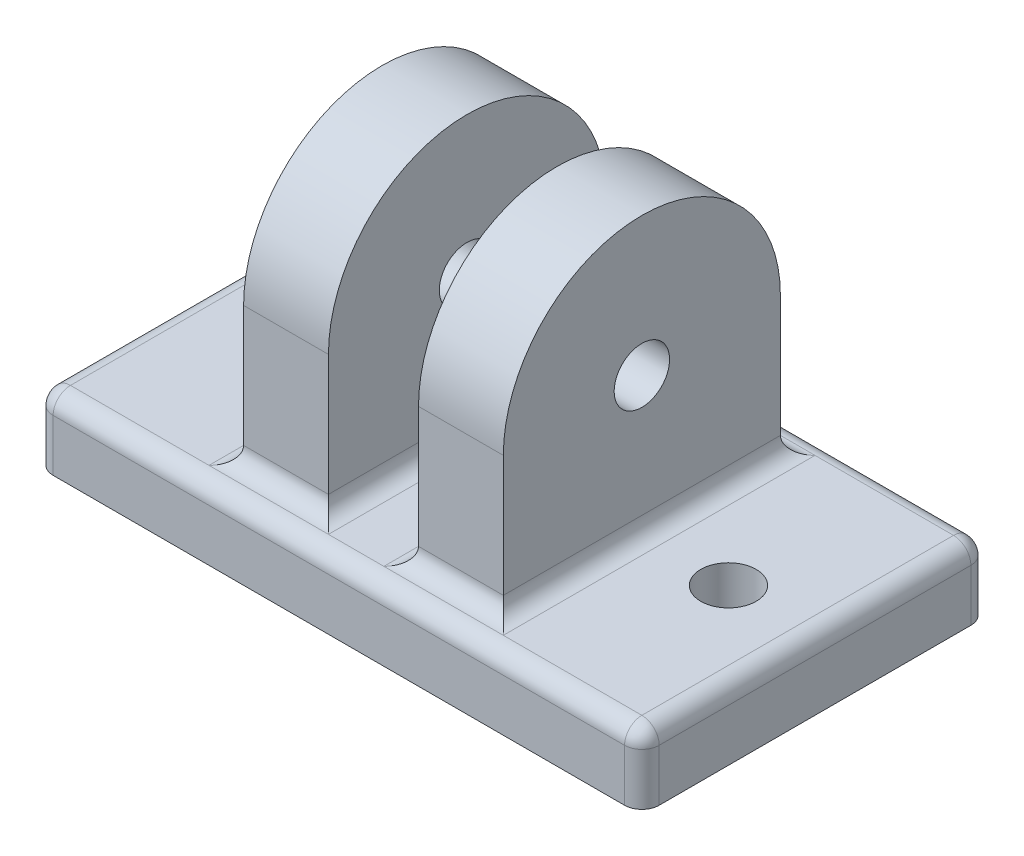
ISO-10303-21;
HEADER;
FILE_DESCRIPTION(('STEP AP214'),'2;1');
FILE_NAME('part.step','',(''),(''),'','','');
FILE_SCHEMA(('AUTOMOTIVE_DESIGN { 1 0 10303 214 1 1 1 1 }'));
ENDSEC;
DATA;
#1=APPLICATION_CONTEXT('core data for automotive mechanical design processes');
#2=APPLICATION_PROTOCOL_DEFINITION('international standard','automotive_design',2000,#1);
#3=PRODUCT_CONTEXT('',#1,'mechanical');
#4=PRODUCT('Part','Part','',(#3));
#5=PRODUCT_RELATED_PRODUCT_CATEGORY('part','',(#4));
#6=PRODUCT_DEFINITION_FORMATION('','',#4);
#7=PRODUCT_DEFINITION_CONTEXT('part definition',#1,'design');
#8=PRODUCT_DEFINITION('design','',#6,#7);
#9=PRODUCT_DEFINITION_SHAPE('','',#8);
#10=(LENGTH_UNIT() NAMED_UNIT(*) SI_UNIT(.MILLI.,.METRE.));
#11=(NAMED_UNIT(*) PLANE_ANGLE_UNIT() SI_UNIT($,.RADIAN.));
#12=(NAMED_UNIT(*) SI_UNIT($,.STERADIAN.) SOLID_ANGLE_UNIT());
#13=UNCERTAINTY_MEASURE_WITH_UNIT(LENGTH_MEASURE(1.E-05),#10,'distance_accuracy_value','');
#14=(GEOMETRIC_REPRESENTATION_CONTEXT(3) GLOBAL_UNCERTAINTY_ASSIGNED_CONTEXT((#13)) GLOBAL_UNIT_ASSIGNED_CONTEXT((#10,
#11,#12)) REPRESENTATION_CONTEXT('',''));
#15=CARTESIAN_POINT('',(0.,0.,0.));
#16=DIRECTION('',(0.,0.,1.));
#17=DIRECTION('',(1.,0.,0.));
#18=AXIS2_PLACEMENT_3D('',#15,#16,#17);
#19=CARTESIAN_POINT('',(15.,-6.,0.));
#20=DIRECTION('',(0.,1.,0.));
#21=DIRECTION('',(0.,0.,1.));
#22=AXIS2_PLACEMENT_3D('',#19,#20,#21);
#23=PLANE('',#22);
#24=DIRECTION('',(0.,0.,1.));
#25=VECTOR('',#24,1.);
#26=CARTESIAN_POINT('',(5.9,-6.,0.));
#27=LINE('',#26,#25);
#28=CARTESIAN_POINT('',(5.9,-6.,-9.));
#29=VERTEX_POINT('',#28);
#30=CARTESIAN_POINT('',(5.9,-6.,8.99999999999999));
#31=VERTEX_POINT('',#30);
#32=EDGE_CURVE('E363',#29,#31,#27,.T.);
#33=ORIENTED_EDGE('',*,*,#32,.T.);
#34=DIRECTION('',(-1.,0.,0.));
#35=VECTOR('',#34,1.);
#36=CARTESIAN_POINT('',(25.,-6.,9.00000000000001));
#37=LINE('',#36,#35);
#38=CARTESIAN_POINT('',(9.1,-6.,8.99999999999999));
#39=VERTEX_POINT('',#38);
#40=EDGE_CURVE('E370',#31,#39,#37,.F.);
#41=ORIENTED_EDGE('',*,*,#40,.T.);
#42=DIRECTION('',(0.,0.,1.));
#43=VECTOR('',#42,1.);
#44=CARTESIAN_POINT('',(9.1,-6.,-8.));
#45=LINE('',#44,#43);
#46=CARTESIAN_POINT('',(9.1,-6.,-9.));
#47=VERTEX_POINT('',#46);
#48=EDGE_CURVE('E366',#39,#47,#45,.F.);
#49=ORIENTED_EDGE('',*,*,#48,.T.);
#50=DIRECTION('',(-1.,0.,0.));
#51=VECTOR('',#50,1.);
#52=CARTESIAN_POINT('',(-10.,-6.,-9.));
#53=LINE('',#52,#51);
#54=EDGE_CURVE('E360',#47,#29,#53,.T.);
#55=ORIENTED_EDGE('',*,*,#54,.T.);
#56=EDGE_LOOP('',(#33,#41,#49,#55));
#57=FACE_BOUND('',#56,.T.);
#58=ADVANCED_FACE('F105',(#57),#23,.T.);
#59=DIRECTION('',(-1.,0.,0.));
#60=VECTOR('',#59,1.);
#61=CARTESIAN_POINT('',(25.,-6.,9.00000000000001));
#62=LINE('',#61,#60);
#63=CARTESIAN_POINT('',(-9.,-6.,9.00000000000001));
#64=VERTEX_POINT('',#63);
#65=CARTESIAN_POINT('',(-1.,-6.,9.00000000000001));
#66=VERTEX_POINT('',#65);
#67=EDGE_CURVE('E353',#64,#66,#62,.F.);
#68=ORIENTED_EDGE('',*,*,#67,.T.);
#69=DIRECTION('',(0.,0.,-1.));
#70=VECTOR('',#69,1.);
#71=CARTESIAN_POINT('',(-1.,-6.,0.));
#72=LINE('',#71,#70);
#73=CARTESIAN_POINT('',(-1.,-6.,-9.));
#74=VERTEX_POINT('',#73);
#75=EDGE_CURVE('E356',#66,#74,#72,.T.);
#76=ORIENTED_EDGE('',*,*,#75,.T.);
#77=DIRECTION('',(-1.,0.,0.));
#78=VECTOR('',#77,1.);
#79=CARTESIAN_POINT('',(-10.,-6.,-9.));
#80=LINE('',#79,#78);
#81=CARTESIAN_POINT('',(-9.,-6.,-9.));
#82=VERTEX_POINT('',#81);
#83=EDGE_CURVE('E347',#74,#82,#80,.T.);
#84=ORIENTED_EDGE('',*,*,#83,.T.);
#85=DIRECTION('',(0.,0.,-1.));
#86=VECTOR('',#85,1.);
#87=CARTESIAN_POINT('',(-9.,-6.,9.99999999999999));
#88=LINE('',#87,#86);
#89=EDGE_CURVE('E350',#82,#64,#88,.F.);
#90=ORIENTED_EDGE('',*,*,#89,.T.);
#91=EDGE_LOOP('',(#68,#76,#84,#90));
#92=FACE_BOUND('',#91,.T.);
#93=CARTESIAN_POINT('',(-5.,-6.,0.));
#94=DIRECTION('',(0.,1.,0.));
#95=DIRECTION('',(0.,0.,1.));
#96=AXIS2_PLACEMENT_3D('',#93,#94,#95);
#97=CIRCLE('',#96,1.6);
#98=CARTESIAN_POINT('',(-5.,-6.,1.6));
#99=VERTEX_POINT('',#98);
#100=EDGE_CURVE('E314',#99,#99,#97,.T.);
#101=ORIENTED_EDGE('',*,*,#100,.F.);
#102=EDGE_LOOP('',(#101));
#103=FACE_BOUND('',#102,.T.);
#104=ADVANCED_FACE('F627',(#92,#103),#23,.T.);
#105=CARTESIAN_POINT('',(15.,0.,0.));
#106=DIRECTION('',(1.,0.,0.));
#107=DIRECTION('',(0.,0.,-1.));
#108=AXIS2_PLACEMENT_3D('',#105,#106,#107);
#109=PLANE('',#108);
#110=CARTESIAN_POINT('',(15.,2.,0.));
#111=DIRECTION('',(-1.,0.,0.));
#112=DIRECTION('',(0.,0.,1.));
#113=AXIS2_PLACEMENT_3D('',#110,#111,#112);
#114=CIRCLE('',#113,1.6);
#115=CARTESIAN_POINT('',(15.,2.,1.6));
#116=VERTEX_POINT('',#115);
#117=EDGE_CURVE('E313',#116,#116,#114,.T.);
#118=ORIENTED_EDGE('',*,*,#117,.T.);
#119=EDGE_LOOP('',(#118));
#120=FACE_BOUND('',#119,.T.);
#121=DIRECTION('',(0.,-1.,0.));
#122=VECTOR('',#121,1.);
#123=CARTESIAN_POINT('',(15.,0.,8.));
#124=LINE('',#123,#122);
#125=CARTESIAN_POINT('',(15.,2.,8.));
#126=VERTEX_POINT('',#125);
#127=CARTESIAN_POINT('',(15.,-5.,7.99999999999999));
#128=VERTEX_POINT('',#127);
#129=EDGE_CURVE('E562',#126,#128,#124,.T.);
#130=ORIENTED_EDGE('',*,*,#129,.T.);
#131=DIRECTION('',(0.,0.,-1.));
#132=VECTOR('',#131,1.);
#133=CARTESIAN_POINT('',(15.,-5.,-8.));
#134=LINE('',#133,#132);
#135=CARTESIAN_POINT('',(15.,-5.,-8.));
#136=VERTEX_POINT('',#135);
#137=EDGE_CURVE('E373',#128,#136,#134,.T.);
#138=ORIENTED_EDGE('',*,*,#137,.T.);
#139=DIRECTION('',(0.,-1.,0.));
#140=VECTOR('',#139,1.);
#141=CARTESIAN_POINT('',(15.,0.,-8.));
#142=LINE('',#141,#140);
#143=CARTESIAN_POINT('',(15.,2.,-8.));
#144=VERTEX_POINT('',#143);
#145=EDGE_CURVE('E291',#144,#136,#142,.T.);
#146=ORIENTED_EDGE('',*,*,#145,.F.);
#147=CARTESIAN_POINT('',(15.,2.,0.));
#148=DIRECTION('',(-1.,0.,0.));
#149=DIRECTION('',(0.,0.,1.));
#150=AXIS2_PLACEMENT_3D('',#147,#148,#149);
#151=CIRCLE('',#150,8.);
#152=EDGE_CURVE('E285',#144,#126,#151,.F.);
#153=ORIENTED_EDGE('',*,*,#152,.T.);
#154=EDGE_LOOP('',(#130,#138,#146,#153));
#155=FACE_BOUND('',#154,.T.);
#156=ADVANCED_FACE('F661',(#120,#155),#109,.T.);
#157=CARTESIAN_POINT('',(0.,0.,0.));
#158=DIRECTION('',(1.,0.,0.));
#159=DIRECTION('',(0.,0.,-1.));
#160=AXIS2_PLACEMENT_3D('',#157,#158,#159);
#161=PLANE('',#160);
#162=CARTESIAN_POINT('',(0.,2.,0.));
#163=DIRECTION('',(-1.,0.,0.));
#164=DIRECTION('',(0.,0.,1.));
#165=AXIS2_PLACEMENT_3D('',#162,#163,#164);
#166=CIRCLE('',#165,1.6);
#167=CARTESIAN_POINT('',(0.,2.,1.6));
#168=VERTEX_POINT('',#167);
#169=EDGE_CURVE('E539',#168,#168,#166,.T.);
#170=ORIENTED_EDGE('',*,*,#169,.F.);
#171=EDGE_LOOP('',(#170));
#172=FACE_BOUND('',#171,.T.);
#173=DIRECTION('',(0.,-1.,0.));
#174=VECTOR('',#173,1.);
#175=CARTESIAN_POINT('',(0.,0.,-8.));
#176=LINE('',#175,#174);
#177=CARTESIAN_POINT('',(0.,2.,-8.));
#178=VERTEX_POINT('',#177);
#179=CARTESIAN_POINT('',(0.,-5.,-8.));
#180=VERTEX_POINT('',#179);
#181=EDGE_CURVE('E281',#178,#180,#176,.T.);
#182=ORIENTED_EDGE('',*,*,#181,.T.);
#183=DIRECTION('',(0.,0.,-1.));
#184=VECTOR('',#183,1.);
#185=CARTESIAN_POINT('',(0.,-5.,0.));
#186=LINE('',#185,#184);
#187=CARTESIAN_POINT('',(0.,-5.,7.99999999999999));
#188=VERTEX_POINT('',#187);
#189=EDGE_CURVE('E384',#180,#188,#186,.F.);
#190=ORIENTED_EDGE('',*,*,#189,.T.);
#191=DIRECTION('',(0.,-1.,0.));
#192=VECTOR('',#191,1.);
#193=CARTESIAN_POINT('',(0.,0.,8.));
#194=LINE('',#193,#192);
#195=CARTESIAN_POINT('',(0.,2.,8.));
#196=VERTEX_POINT('',#195);
#197=EDGE_CURVE('E558',#196,#188,#194,.T.);
#198=ORIENTED_EDGE('',*,*,#197,.F.);
#199=CARTESIAN_POINT('',(0.,2.,0.));
#200=DIRECTION('',(-1.,0.,0.));
#201=DIRECTION('',(0.,0.,1.));
#202=AXIS2_PLACEMENT_3D('',#199,#200,#201);
#203=CIRCLE('',#202,8.);
#204=EDGE_CURVE('E572',#178,#196,#203,.F.);
#205=ORIENTED_EDGE('',*,*,#204,.F.);
#206=EDGE_LOOP('',(#182,#190,#198,#205));
#207=FACE_BOUND('',#206,.T.);
#208=ADVANCED_FACE('F704',(#172,#207),#161,.F.);
#209=CARTESIAN_POINT('',(15.,0.,-8.));
#210=DIRECTION('',(0.,0.,-1.));
#211=DIRECTION('',(0.,1.,0.));
#212=AXIS2_PLACEMENT_3D('',#209,#210,#211);
#213=PLANE('',#212);
#214=ORIENTED_EDGE('',*,*,#145,.T.);
#215=DIRECTION('',(-1.,0.,0.));
#216=VECTOR('',#215,1.);
#217=CARTESIAN_POINT('',(10.1,-5.,-8.));
#218=LINE('',#217,#216);
#219=CARTESIAN_POINT('',(10.1,-5.,-8.));
#220=VERTEX_POINT('',#219);
#221=EDGE_CURVE('E376',#136,#220,#218,.T.);
#222=ORIENTED_EDGE('',*,*,#221,.T.);
#223=DIRECTION('',(0.,1.,0.));
#224=VECTOR('',#223,1.);
#225=CARTESIAN_POINT('',(10.1,0.,-8.));
#226=LINE('',#225,#224);
#227=CARTESIAN_POINT('',(10.1,2.,-8.));
#228=VERTEX_POINT('',#227);
#229=EDGE_CURVE('E555',#220,#228,#226,.T.);
#230=ORIENTED_EDGE('',*,*,#229,.T.);
#231=DIRECTION('',(-1.,0.,0.));
#232=VECTOR('',#231,1.);
#233=CARTESIAN_POINT('',(15.,2.,-8.));
#234=LINE('',#233,#232);
#235=EDGE_CURVE('E284',#144,#228,#234,.T.);
#236=ORIENTED_EDGE('',*,*,#235,.F.);
#237=EDGE_LOOP('',(#214,#222,#230,#236));
#238=FACE_BOUND('',#237,.T.);
#239=ADVANCED_FACE('F579',(#238),#213,.T.);
#240=CARTESIAN_POINT('',(15.,2.,0.));
#241=DIRECTION('',(-1.,0.,0.));
#242=DIRECTION('',(0.,0.,1.));
#243=AXIS2_PLACEMENT_3D('',#240,#241,#242);
#244=CYLINDRICAL_SURFACE('',#243,8.);
#245=CARTESIAN_POINT('',(10.1,2.,0.));
#246=DIRECTION('',(-1.,0.,0.));
#247=DIRECTION('',(0.,0.,1.));
#248=AXIS2_PLACEMENT_3D('',#245,#246,#247);
#249=CIRCLE('',#248,8.);
#250=CARTESIAN_POINT('',(10.1,2.,8.));
#251=VERTEX_POINT('',#250);
#252=EDGE_CURVE('E268',#251,#228,#249,.T.);
#253=ORIENTED_EDGE('',*,*,#252,.F.);
#254=DIRECTION('',(-1.,0.,0.));
#255=VECTOR('',#254,1.);
#256=CARTESIAN_POINT('',(15.,2.,8.));
#257=LINE('',#256,#255);
#258=EDGE_CURVE('E566',#126,#251,#257,.T.);
#259=ORIENTED_EDGE('',*,*,#258,.F.);
#260=ORIENTED_EDGE('',*,*,#152,.F.);
#261=ORIENTED_EDGE('',*,*,#235,.T.);
#262=EDGE_LOOP('',(#253,#259,#260,#261));
#263=FACE_BOUND('',#262,.T.);
#264=ADVANCED_FACE('F665',(#263),#244,.T.);
#265=CARTESIAN_POINT('',(15.,0.,8.));
#266=DIRECTION('',(0.,0.,-1.));
#267=DIRECTION('',(0.,1.,0.));
#268=AXIS2_PLACEMENT_3D('',#265,#266,#267);
#269=PLANE('',#268);
#270=DIRECTION('',(0.,1.,0.));
#271=VECTOR('',#270,1.);
#272=CARTESIAN_POINT('',(10.1,0.,8.));
#273=LINE('',#272,#271);
#274=CARTESIAN_POINT('',(10.1,-5.,7.99999999999999));
#275=VERTEX_POINT('',#274);
#276=EDGE_CURVE('E305',#275,#251,#273,.T.);
#277=ORIENTED_EDGE('',*,*,#276,.F.);
#278=DIRECTION('',(-1.,0.,0.));
#279=VECTOR('',#278,1.);
#280=CARTESIAN_POINT('',(15.,-5.,7.99999999999999));
#281=LINE('',#280,#279);
#282=EDGE_CURVE('E327',#275,#128,#281,.F.);
#283=ORIENTED_EDGE('',*,*,#282,.T.);
#284=ORIENTED_EDGE('',*,*,#129,.F.);
#285=ORIENTED_EDGE('',*,*,#258,.T.);
#286=EDGE_LOOP('',(#277,#283,#284,#285));
#287=FACE_BOUND('',#286,.T.);
#288=ADVANCED_FACE('F660',(#287),#269,.F.);
#289=CARTESIAN_POINT('',(15.,-10.,-10.));
#290=DIRECTION('',(0.,0.,1.));
#291=DIRECTION('',(1.,0.,0.));
#292=AXIS2_PLACEMENT_3D('',#289,#290,#291);
#293=PLANE('',#292);
#294=DIRECTION('',(-1.,0.,0.));
#295=VECTOR('',#294,1.);
#296=CARTESIAN_POINT('',(15.,-10.,-10.));
#297=LINE('',#296,#295);
#298=CARTESIAN_POINT('',(24.,-10.,-10.));
#299=VERTEX_POINT('',#298);
#300=CARTESIAN_POINT('',(-9.,-10.,-10.));
#301=VERTEX_POINT('',#300);
#302=EDGE_CURVE('E290',#299,#301,#297,.T.);
#303=ORIENTED_EDGE('',*,*,#302,.T.);
#304=DIRECTION('',(0.,-1.,0.));
#305=VECTOR('',#304,1.);
#306=CARTESIAN_POINT('',(-9.,-10.,-10.));
#307=LINE('',#306,#305);
#308=CARTESIAN_POINT('',(-9.,-7.,-10.));
#309=VERTEX_POINT('',#308);
#310=EDGE_CURVE('E412',#301,#309,#307,.F.);
#311=ORIENTED_EDGE('',*,*,#310,.T.);
#312=DIRECTION('',(-1.,0.,0.));
#313=VECTOR('',#312,1.);
#314=CARTESIAN_POINT('',(25.,-7.,-10.));
#315=LINE('',#314,#313);
#316=CARTESIAN_POINT('',(24.,-7.,-10.));
#317=VERTEX_POINT('',#316);
#318=EDGE_CURVE('E409',#309,#317,#315,.F.);
#319=ORIENTED_EDGE('',*,*,#318,.T.);
#320=DIRECTION('',(0.,-1.,0.));
#321=VECTOR('',#320,1.);
#322=CARTESIAN_POINT('',(24.,-10.,-10.));
#323=LINE('',#322,#321);
#324=EDGE_CURVE('E406',#317,#299,#323,.T.);
#325=ORIENTED_EDGE('',*,*,#324,.T.);
#326=EDGE_LOOP('',(#303,#311,#319,#325));
#327=FACE_BOUND('',#326,.T.);
#328=ADVANCED_FACE('F719',(#327),#293,.F.);
#329=CARTESIAN_POINT('',(15.,-10.,10.));
#330=DIRECTION('',(0.,0.,-1.));
#331=DIRECTION('',(-1.,0.,0.));
#332=AXIS2_PLACEMENT_3D('',#329,#330,#331);
#333=PLANE('',#332);
#334=DIRECTION('',(-1.,0.,0.));
#335=VECTOR('',#334,1.);
#336=CARTESIAN_POINT('',(-10.,-7.,10.));
#337=LINE('',#336,#335);
#338=CARTESIAN_POINT('',(24.,-7.,10.));
#339=VERTEX_POINT('',#338);
#340=CARTESIAN_POINT('',(-9.,-7.,10.));
#341=VERTEX_POINT('',#340);
#342=EDGE_CURVE('E390',#339,#341,#337,.T.);
#343=ORIENTED_EDGE('',*,*,#342,.T.);
#344=DIRECTION('',(0.,1.,0.));
#345=VECTOR('',#344,1.);
#346=CARTESIAN_POINT('',(-9.,-10.,10.));
#347=LINE('',#346,#345);
#348=CARTESIAN_POINT('',(-9.,-10.,10.));
#349=VERTEX_POINT('',#348);
#350=EDGE_CURVE('E394',#341,#349,#347,.F.);
#351=ORIENTED_EDGE('',*,*,#350,.T.);
#352=DIRECTION('',(-1.,0.,0.));
#353=VECTOR('',#352,1.);
#354=CARTESIAN_POINT('',(15.,-10.,10.));
#355=LINE('',#354,#353);
#356=CARTESIAN_POINT('',(24.,-10.,10.));
#357=VERTEX_POINT('',#356);
#358=EDGE_CURVE('E298',#357,#349,#355,.T.);
#359=ORIENTED_EDGE('',*,*,#358,.F.);
#360=DIRECTION('',(0.,1.,0.));
#361=VECTOR('',#360,1.);
#362=CARTESIAN_POINT('',(24.,-6.00000000000001,10.));
#363=LINE('',#362,#361);
#364=EDGE_CURVE('E387',#357,#339,#363,.T.);
#365=ORIENTED_EDGE('',*,*,#364,.T.);
#366=EDGE_LOOP('',(#343,#351,#359,#365));
#367=FACE_BOUND('',#366,.T.);
#368=ADVANCED_FACE('F644',(#367),#333,.F.);
#369=CARTESIAN_POINT('',(15.,-10.,10.));
#370=DIRECTION('',(0.,1.,0.));
#371=DIRECTION('',(0.,0.,1.));
#372=AXIS2_PLACEMENT_3D('',#369,#370,#371);
#373=PLANE('',#372);
#374=CARTESIAN_POINT('',(20.,-10.,0.));
#375=DIRECTION('',(0.,1.,0.));
#376=DIRECTION('',(0.,0.,1.));
#377=AXIS2_PLACEMENT_3D('',#374,#375,#376);
#378=CIRCLE('',#377,1.6);
#379=CARTESIAN_POINT('',(20.,-10.,1.6));
#380=VERTEX_POINT('',#379);
#381=EDGE_CURVE('E319',#380,#380,#378,.T.);
#382=ORIENTED_EDGE('',*,*,#381,.T.);
#383=EDGE_LOOP('',(#382));
#384=FACE_BOUND('',#383,.T.);
#385=CARTESIAN_POINT('',(-5.,-10.,0.));
#386=DIRECTION('',(0.,1.,0.));
#387=DIRECTION('',(0.,0.,-1.));
#388=AXIS2_PLACEMENT_3D('',#385,#386,#387);
#389=CIRCLE('',#388,1.6);
#390=CARTESIAN_POINT('',(-5.,-10.,-1.6));
#391=VERTEX_POINT('',#390);
#392=EDGE_CURVE('E521',#391,#391,#389,.T.);
#393=ORIENTED_EDGE('',*,*,#392,.T.);
#394=EDGE_LOOP('',(#393));
#395=FACE_BOUND('',#394,.T.);
#396=DIRECTION('',(0.,0.,1.));
#397=VECTOR('',#396,1.);
#398=CARTESIAN_POINT('',(-10.,-10.,-10.));
#399=LINE('',#398,#397);
#400=CARTESIAN_POINT('',(-10.,-10.,-9.));
#401=VERTEX_POINT('',#400);
#402=CARTESIAN_POINT('',(-10.,-10.,9.00000000000001));
#403=VERTEX_POINT('',#402);
#404=EDGE_CURVE('E535',#401,#403,#399,.T.);
#405=ORIENTED_EDGE('',*,*,#404,.F.);
#406=CARTESIAN_POINT('',(-9.,-10.,-9.));
#407=DIRECTION('',(0.,1.,0.));
#408=DIRECTION('',(0.,0.,1.));
#409=AXIS2_PLACEMENT_3D('',#406,#407,#408);
#410=CIRCLE('',#409,1.);
#411=EDGE_CURVE('E12',#401,#301,#410,.F.);
#412=ORIENTED_EDGE('',*,*,#411,.T.);
#413=ORIENTED_EDGE('',*,*,#302,.F.);
#414=CARTESIAN_POINT('',(24.,-10.,-9.));
#415=DIRECTION('',(0.,1.,0.));
#416=DIRECTION('',(0.,0.,1.));
#417=AXIS2_PLACEMENT_3D('',#414,#415,#416);
#418=CIRCLE('',#417,1.);
#419=CARTESIAN_POINT('',(25.,-10.,-9.));
#420=VERTEX_POINT('',#419);
#421=EDGE_CURVE('E422',#299,#420,#418,.F.);
#422=ORIENTED_EDGE('',*,*,#421,.T.);
#423=DIRECTION('',(0.,0.,1.));
#424=VECTOR('',#423,1.);
#425=CARTESIAN_POINT('',(25.,-10.,-10.));
#426=LINE('',#425,#424);
#427=CARTESIAN_POINT('',(25.,-10.,9.00000000000001));
#428=VERTEX_POINT('',#427);
#429=EDGE_CURVE('E323',#420,#428,#426,.T.);
#430=ORIENTED_EDGE('',*,*,#429,.T.);
#431=CARTESIAN_POINT('',(24.,-10.,9.00000000000001));
#432=DIRECTION('',(0.,1.,0.));
#433=DIRECTION('',(0.,0.,1.));
#434=AXIS2_PLACEMENT_3D('',#431,#432,#433);
#435=CIRCLE('',#434,1.);
#436=EDGE_CURVE('E425',#428,#357,#435,.F.);
#437=ORIENTED_EDGE('',*,*,#436,.T.);
#438=ORIENTED_EDGE('',*,*,#358,.T.);
#439=CARTESIAN_POINT('',(-9.,-10.,9.00000000000001));
#440=DIRECTION('',(0.,1.,0.));
#441=DIRECTION('',(0.,0.,1.));
#442=AXIS2_PLACEMENT_3D('',#439,#440,#441);
#443=CIRCLE('',#442,1.);
#444=EDGE_CURVE('E115',#349,#403,#443,.F.);
#445=ORIENTED_EDGE('',*,*,#444,.T.);
#446=EDGE_LOOP('',(#405,#412,#413,#422,#430,#437,#438,#445));
#447=FACE_BOUND('',#446,.T.);
#448=ADVANCED_FACE('F695',(#384,#395,#447),#373,.F.);
#449=DIRECTION('',(0.,1.,0.));
#450=VECTOR('',#449,1.);
#451=CARTESIAN_POINT('',(4.9,0.,-8.));
#452=LINE('',#451,#450);
#453=CARTESIAN_POINT('',(4.9,-5.,-8.));
#454=VERTEX_POINT('',#453);
#455=CARTESIAN_POINT('',(4.9,2.,-8.));
#456=VERTEX_POINT('',#455);
#457=EDGE_CURVE('E256',#454,#456,#452,.T.);
#458=ORIENTED_EDGE('',*,*,#457,.F.);
#459=DIRECTION('',(-1.,0.,0.));
#460=VECTOR('',#459,1.);
#461=CARTESIAN_POINT('',(0.,-5.,-8.));
#462=LINE('',#461,#460);
#463=EDGE_CURVE('E381',#454,#180,#462,.T.);
#464=ORIENTED_EDGE('',*,*,#463,.T.);
#465=ORIENTED_EDGE('',*,*,#181,.F.);
#466=EDGE_CURVE('E273',#456,#178,#234,.T.);
#467=ORIENTED_EDGE('',*,*,#466,.F.);
#468=EDGE_LOOP('',(#458,#464,#465,#467));
#469=FACE_BOUND('',#468,.T.);
#470=ADVANCED_FACE('F279',(#469),#213,.T.);
#471=DIRECTION('',(-1.,0.,0.));
#472=VECTOR('',#471,1.);
#473=CARTESIAN_POINT('',(-10.,-6.,-9.));
#474=LINE('',#473,#472);
#475=CARTESIAN_POINT('',(24.,-6.,-9.));
#476=VERTEX_POINT('',#475);
#477=CARTESIAN_POINT('',(16.,-6.,-9.));
#478=VERTEX_POINT('',#477);
#479=EDGE_CURVE('E337',#476,#478,#474,.T.);
#480=ORIENTED_EDGE('',*,*,#479,.T.);
#481=DIRECTION('',(0.,0.,-1.));
#482=VECTOR('',#481,1.);
#483=CARTESIAN_POINT('',(16.,-6.,7.99999999999999));
#484=LINE('',#483,#482);
#485=CARTESIAN_POINT('',(16.,-6.,9.00000000000001));
#486=VERTEX_POINT('',#485);
#487=EDGE_CURVE('E343',#478,#486,#484,.F.);
#488=ORIENTED_EDGE('',*,*,#487,.T.);
#489=DIRECTION('',(-1.,0.,0.));
#490=VECTOR('',#489,1.);
#491=CARTESIAN_POINT('',(25.,-6.,9.00000000000001));
#492=LINE('',#491,#490);
#493=CARTESIAN_POINT('',(24.,-6.,9.00000000000001));
#494=VERTEX_POINT('',#493);
#495=EDGE_CURVE('E340',#486,#494,#492,.F.);
#496=ORIENTED_EDGE('',*,*,#495,.T.);
#497=DIRECTION('',(0.,0.,-1.));
#498=VECTOR('',#497,1.);
#499=CARTESIAN_POINT('',(24.,-6.,0.));
#500=LINE('',#499,#498);
#501=EDGE_CURVE('E334',#494,#476,#500,.T.);
#502=ORIENTED_EDGE('',*,*,#501,.T.);
#503=EDGE_LOOP('',(#480,#488,#496,#502));
#504=FACE_BOUND('',#503,.T.);
#505=CARTESIAN_POINT('',(20.,-6.,0.));
#506=DIRECTION('',(0.,1.,0.));
#507=DIRECTION('',(0.,0.,1.));
#508=AXIS2_PLACEMENT_3D('',#505,#506,#507);
#509=CIRCLE('',#508,1.6);
#510=CARTESIAN_POINT('',(20.,-6.,1.6));
#511=VERTEX_POINT('',#510);
#512=EDGE_CURVE('E318',#511,#511,#509,.T.);
#513=ORIENTED_EDGE('',*,*,#512,.F.);
#514=EDGE_LOOP('',(#513));
#515=FACE_BOUND('',#514,.T.);
#516=ADVANCED_FACE('F595',(#504,#515),#23,.T.);
#517=CARTESIAN_POINT('',(4.9,2.,0.));
#518=DIRECTION('',(-1.,0.,0.));
#519=DIRECTION('',(0.,0.,1.));
#520=AXIS2_PLACEMENT_3D('',#517,#518,#519);
#521=CIRCLE('',#520,8.);
#522=CARTESIAN_POINT('',(4.9,2.,8.));
#523=VERTEX_POINT('',#522);
#524=EDGE_CURVE('E260',#523,#456,#521,.T.);
#525=ORIENTED_EDGE('',*,*,#524,.T.);
#526=ORIENTED_EDGE('',*,*,#466,.T.);
#527=ORIENTED_EDGE('',*,*,#204,.T.);
#528=EDGE_CURVE('E275',#523,#196,#257,.T.);
#529=ORIENTED_EDGE('',*,*,#528,.F.);
#530=EDGE_LOOP('',(#525,#526,#527,#529));
#531=FACE_BOUND('',#530,.T.);
#532=ADVANCED_FACE('F271',(#531),#244,.T.);
#533=ORIENTED_EDGE('',*,*,#197,.T.);
#534=DIRECTION('',(-1.,0.,0.));
#535=VECTOR('',#534,1.);
#536=CARTESIAN_POINT('',(15.,-5.,7.99999999999999));
#537=LINE('',#536,#535);
#538=CARTESIAN_POINT('',(4.9,-5.,7.99999999999999));
#539=VERTEX_POINT('',#538);
#540=EDGE_CURVE('E308',#188,#539,#537,.F.);
#541=ORIENTED_EDGE('',*,*,#540,.T.);
#542=DIRECTION('',(0.,1.,0.));
#543=VECTOR('',#542,1.);
#544=CARTESIAN_POINT('',(4.9,0.,8.));
#545=LINE('',#544,#543);
#546=EDGE_CURVE('E302',#539,#523,#545,.T.);
#547=ORIENTED_EDGE('',*,*,#546,.T.);
#548=ORIENTED_EDGE('',*,*,#528,.T.);
#549=EDGE_LOOP('',(#533,#541,#547,#548));
#550=FACE_BOUND('',#549,.T.);
#551=ADVANCED_FACE('F669',(#550),#269,.F.);
#552=CARTESIAN_POINT('',(10.1,0.,0.));
#553=DIRECTION('',(-1.,0.,0.));
#554=DIRECTION('',(0.,0.,1.));
#555=AXIS2_PLACEMENT_3D('',#552,#553,#554);
#556=PLANE('',#555);
#557=CARTESIAN_POINT('',(10.1,2.,0.));
#558=DIRECTION('',(-1.,0.,0.));
#559=DIRECTION('',(0.,0.,1.));
#560=AXIS2_PLACEMENT_3D('',#557,#558,#559);
#561=CIRCLE('',#560,1.6);
#562=CARTESIAN_POINT('',(10.1,2.,1.6));
#563=VERTEX_POINT('',#562);
#564=EDGE_CURVE('E277',#563,#563,#561,.T.);
#565=ORIENTED_EDGE('',*,*,#564,.F.);
#566=EDGE_LOOP('',(#565));
#567=FACE_BOUND('',#566,.T.);
#568=ORIENTED_EDGE('',*,*,#229,.F.);
#569=DIRECTION('',(0.,0.,1.));
#570=VECTOR('',#569,1.);
#571=CARTESIAN_POINT('',(10.1,-5.,8.));
#572=LINE('',#571,#570);
#573=EDGE_CURVE('E331',#220,#275,#572,.T.);
#574=ORIENTED_EDGE('',*,*,#573,.T.);
#575=ORIENTED_EDGE('',*,*,#276,.T.);
#576=ORIENTED_EDGE('',*,*,#252,.T.);
#577=EDGE_LOOP('',(#568,#574,#575,#576));
#578=FACE_BOUND('',#577,.T.);
#579=ADVANCED_FACE('F667',(#567,#578),#556,.T.);
#580=CARTESIAN_POINT('',(4.9,0.,0.));
#581=DIRECTION('',(-1.,0.,0.));
#582=DIRECTION('',(0.,0.,1.));
#583=AXIS2_PLACEMENT_3D('',#580,#581,#582);
#584=PLANE('',#583);
#585=CARTESIAN_POINT('',(4.9,2.,0.));
#586=DIRECTION('',(-1.,0.,0.));
#587=DIRECTION('',(0.,0.,1.));
#588=AXIS2_PLACEMENT_3D('',#585,#586,#587);
#589=CIRCLE('',#588,1.6);
#590=CARTESIAN_POINT('',(4.9,2.,1.6));
#591=VERTEX_POINT('',#590);
#592=EDGE_CURVE('E309',#591,#591,#589,.T.);
#593=ORIENTED_EDGE('',*,*,#592,.T.);
#594=EDGE_LOOP('',(#593));
#595=FACE_BOUND('',#594,.T.);
#596=ORIENTED_EDGE('',*,*,#546,.F.);
#597=DIRECTION('',(0.,0.,1.));
#598=VECTOR('',#597,1.);
#599=CARTESIAN_POINT('',(4.9,-5.,0.));
#600=LINE('',#599,#598);
#601=EDGE_CURVE('E263',#539,#454,#600,.F.);
#602=ORIENTED_EDGE('',*,*,#601,.T.);
#603=ORIENTED_EDGE('',*,*,#457,.T.);
#604=ORIENTED_EDGE('',*,*,#524,.F.);
#605=EDGE_LOOP('',(#596,#602,#603,#604));
#606=FACE_BOUND('',#605,.T.);
#607=ADVANCED_FACE('F259',(#595,#606),#584,.F.);
#608=CARTESIAN_POINT('',(15.,2.,0.));
#609=DIRECTION('',(-1.,0.,0.));
#610=DIRECTION('',(0.,0.,1.));
#611=AXIS2_PLACEMENT_3D('',#608,#609,#610);
#612=CYLINDRICAL_SURFACE('',#611,1.6);
#613=ORIENTED_EDGE('',*,*,#169,.T.);
#614=EDGE_LOOP('',(#613));
#615=FACE_BOUND('',#614,.T.);
#616=ORIENTED_EDGE('',*,*,#592,.F.);
#617=EDGE_LOOP('',(#616));
#618=FACE_BOUND('',#617,.T.);
#619=ADVANCED_FACE('F676',(#615,#618),#612,.F.);
#620=ORIENTED_EDGE('',*,*,#564,.T.);
#621=EDGE_LOOP('',(#620));
#622=FACE_BOUND('',#621,.T.);
#623=ORIENTED_EDGE('',*,*,#117,.F.);
#624=EDGE_LOOP('',(#623));
#625=FACE_BOUND('',#624,.T.);
#626=ADVANCED_FACE('F792',(#622,#625),#612,.F.);
#627=CARTESIAN_POINT('',(-10.,0.,0.));
#628=DIRECTION('',(1.,0.,0.));
#629=DIRECTION('',(0.,0.,-1.));
#630=AXIS2_PLACEMENT_3D('',#627,#628,#629);
#631=PLANE('',#630);
#632=DIRECTION('',(0.,0.,-1.));
#633=VECTOR('',#632,1.);
#634=CARTESIAN_POINT('',(-10.,-7.,-10.));
#635=LINE('',#634,#633);
#636=CARTESIAN_POINT('',(-10.,-7.,9.00000000000001));
#637=VERTEX_POINT('',#636);
#638=CARTESIAN_POINT('',(-10.,-7.,-9.));
#639=VERTEX_POINT('',#638);
#640=EDGE_CURVE('E400',#637,#639,#635,.T.);
#641=ORIENTED_EDGE('',*,*,#640,.T.);
#642=DIRECTION('',(0.,-1.,0.));
#643=VECTOR('',#642,1.);
#644=CARTESIAN_POINT('',(-10.,0.,-9.));
#645=LINE('',#644,#643);
#646=EDGE_CURVE('E403',#639,#401,#645,.T.);
#647=ORIENTED_EDGE('',*,*,#646,.T.);
#648=ORIENTED_EDGE('',*,*,#404,.T.);
#649=DIRECTION('',(0.,1.,0.));
#650=VECTOR('',#649,1.);
#651=CARTESIAN_POINT('',(-10.,0.,9.00000000000001));
#652=LINE('',#651,#650);
#653=EDGE_CURVE('E397',#403,#637,#652,.T.);
#654=ORIENTED_EDGE('',*,*,#653,.T.);
#655=EDGE_LOOP('',(#641,#647,#648,#654));
#656=FACE_BOUND('',#655,.T.);
#657=ADVANCED_FACE('F784',(#656),#631,.F.);
#658=CARTESIAN_POINT('',(25.,0.,0.));
#659=DIRECTION('',(1.,0.,0.));
#660=DIRECTION('',(0.,0.,-1.));
#661=AXIS2_PLACEMENT_3D('',#658,#659,#660);
#662=PLANE('',#661);
#663=DIRECTION('',(0.,0.,-1.));
#664=VECTOR('',#663,1.);
#665=CARTESIAN_POINT('',(25.,-7.,0.));
#666=LINE('',#665,#664);
#667=CARTESIAN_POINT('',(25.,-7.,-9.));
#668=VERTEX_POINT('',#667);
#669=CARTESIAN_POINT('',(25.,-7.,9.00000000000001));
#670=VERTEX_POINT('',#669);
#671=EDGE_CURVE('E123',#668,#670,#666,.F.);
#672=ORIENTED_EDGE('',*,*,#671,.T.);
#673=DIRECTION('',(0.,1.,0.));
#674=VECTOR('',#673,1.);
#675=CARTESIAN_POINT('',(25.,-10.,9.00000000000001));
#676=LINE('',#675,#674);
#677=EDGE_CURVE('E419',#670,#428,#676,.F.);
#678=ORIENTED_EDGE('',*,*,#677,.T.);
#679=ORIENTED_EDGE('',*,*,#429,.F.);
#680=DIRECTION('',(0.,-1.,0.));
#681=VECTOR('',#680,1.);
#682=CARTESIAN_POINT('',(25.,-6.00000000000001,-9.));
#683=LINE('',#682,#681);
#684=EDGE_CURVE('E128',#420,#668,#683,.F.);
#685=ORIENTED_EDGE('',*,*,#684,.T.);
#686=EDGE_LOOP('',(#672,#678,#679,#685));
#687=FACE_BOUND('',#686,.T.);
#688=ADVANCED_FACE('F781',(#687),#662,.T.);
#689=CARTESIAN_POINT('',(-5.,-10.,0.));
#690=DIRECTION('',(0.,1.,0.));
#691=DIRECTION('',(0.,0.,1.));
#692=AXIS2_PLACEMENT_3D('',#689,#690,#691);
#693=CYLINDRICAL_SURFACE('',#692,1.6);
#694=ORIENTED_EDGE('',*,*,#100,.T.);
#695=EDGE_LOOP('',(#694));
#696=FACE_BOUND('',#695,.T.);
#697=ORIENTED_EDGE('',*,*,#392,.F.);
#698=EDGE_LOOP('',(#697));
#699=FACE_BOUND('',#698,.T.);
#700=ADVANCED_FACE('F783',(#696,#699),#693,.F.);
#701=CARTESIAN_POINT('',(20.,-10.,0.));
#702=DIRECTION('',(0.,1.,0.));
#703=DIRECTION('',(0.,0.,1.));
#704=AXIS2_PLACEMENT_3D('',#701,#702,#703);
#705=CYLINDRICAL_SURFACE('',#704,1.6);
#706=ORIENTED_EDGE('',*,*,#512,.T.);
#707=EDGE_LOOP('',(#706));
#708=FACE_BOUND('',#707,.T.);
#709=ORIENTED_EDGE('',*,*,#381,.F.);
#710=EDGE_LOOP('',(#709));
#711=FACE_BOUND('',#710,.T.);
#712=ADVANCED_FACE('F774',(#708,#711),#705,.F.);
#713=CARTESIAN_POINT('',(-9.,0.,-9.));
#714=DIRECTION('',(0.,-1.,0.));
#715=DIRECTION('',(0.,0.,-1.));
#716=AXIS2_PLACEMENT_3D('',#713,#714,#715);
#717=CYLINDRICAL_SURFACE('',#716,1.);
#718=ORIENTED_EDGE('',*,*,#411,.F.);
#719=ORIENTED_EDGE('',*,*,#646,.F.);
#720=CARTESIAN_POINT('',(-9.,-7.,-9.));
#721=DIRECTION('',(0.,1.,0.));
#722=DIRECTION('',(0.,0.,1.));
#723=AXIS2_PLACEMENT_3D('',#720,#721,#722);
#724=CIRCLE('',#723,1.);
#725=EDGE_CURVE('E109',#309,#639,#724,.T.);
#726=ORIENTED_EDGE('',*,*,#725,.F.);
#727=ORIENTED_EDGE('',*,*,#310,.F.);
#728=EDGE_LOOP('',(#718,#719,#726,#727));
#729=FACE_BOUND('',#728,.T.);
#730=ADVANCED_FACE('F107',(#729),#717,.T.);
#731=CARTESIAN_POINT('',(24.,-10.,-9.));
#732=DIRECTION('',(0.,1.,0.));
#733=DIRECTION('',(0.,0.,1.));
#734=AXIS2_PLACEMENT_3D('',#731,#732,#733);
#735=CYLINDRICAL_SURFACE('',#734,1.);
#736=ORIENTED_EDGE('',*,*,#421,.F.);
#737=ORIENTED_EDGE('',*,*,#324,.F.);
#738=CARTESIAN_POINT('',(24.,-7.,-9.));
#739=DIRECTION('',(0.,1.,0.));
#740=DIRECTION('',(0.,0.,1.));
#741=AXIS2_PLACEMENT_3D('',#738,#739,#740);
#742=CIRCLE('',#741,1.);
#743=EDGE_CURVE('E513',#668,#317,#742,.T.);
#744=ORIENTED_EDGE('',*,*,#743,.F.);
#745=ORIENTED_EDGE('',*,*,#684,.F.);
#746=EDGE_LOOP('',(#736,#737,#744,#745));
#747=FACE_BOUND('',#746,.T.);
#748=ADVANCED_FACE('F768',(#747),#735,.T.);
#749=CARTESIAN_POINT('',(-9.,-7.,-9.));
#750=DIRECTION('',(-1.,0.,0.));
#751=DIRECTION('',(0.,0.,1.));
#752=AXIS2_PLACEMENT_3D('',#749,#750,#751);
#753=SPHERICAL_SURFACE('',#752,1.);
#754=CARTESIAN_POINT('',(-9.,-7.,-9.));
#755=DIRECTION('',(-1.,0.,0.));
#756=DIRECTION('',(0.,0.,1.));
#757=AXIS2_PLACEMENT_3D('',#754,#755,#756);
#758=CIRCLE('',#757,1.);
#759=EDGE_CURVE('E494',#309,#82,#758,.F.);
#760=ORIENTED_EDGE('',*,*,#759,.F.);
#761=ORIENTED_EDGE('',*,*,#725,.T.);
#762=CARTESIAN_POINT('',(-9.,-7.,-9.));
#763=DIRECTION('',(0.,0.,-1.));
#764=DIRECTION('',(-1.,0.,0.));
#765=AXIS2_PLACEMENT_3D('',#762,#763,#764);
#766=CIRCLE('',#765,1.);
#767=EDGE_CURVE('E498',#82,#639,#766,.F.);
#768=ORIENTED_EDGE('',*,*,#767,.F.);
#769=EDGE_LOOP('',(#760,#761,#768));
#770=FACE_BOUND('',#769,.T.);
#771=ADVANCED_FACE('F766',(#770),#753,.T.);
#772=CARTESIAN_POINT('',(24.,-7.,-9.));
#773=DIRECTION('',(1.,0.,0.));
#774=DIRECTION('',(0.,0.,-1.));
#775=AXIS2_PLACEMENT_3D('',#772,#773,#774);
#776=SPHERICAL_SURFACE('',#775,1.);
#777=CARTESIAN_POINT('',(24.,-7.,-9.));
#778=DIRECTION('',(1.,0.,0.));
#779=DIRECTION('',(0.,0.,-1.));
#780=AXIS2_PLACEMENT_3D('',#777,#778,#779);
#781=CIRCLE('',#780,1.);
#782=EDGE_CURVE('E490',#476,#317,#781,.F.);
#783=ORIENTED_EDGE('',*,*,#782,.F.);
#784=CARTESIAN_POINT('',(24.,-7.,-9.));
#785=DIRECTION('',(0.,0.,-1.));
#786=DIRECTION('',(-1.,0.,0.));
#787=AXIS2_PLACEMENT_3D('',#784,#785,#786);
#788=CIRCLE('',#787,1.);
#789=EDGE_CURVE('E502',#668,#476,#788,.F.);
#790=ORIENTED_EDGE('',*,*,#789,.F.);
#791=ORIENTED_EDGE('',*,*,#743,.T.);
#792=EDGE_LOOP('',(#783,#790,#791));
#793=FACE_BOUND('',#792,.T.);
#794=ADVANCED_FACE('F763',(#793),#776,.T.);
#795=CARTESIAN_POINT('',(15.,-5.,-9.));
#796=DIRECTION('',(1.,0.,0.));
#797=DIRECTION('',(0.,0.,-1.));
#798=AXIS2_PLACEMENT_3D('',#795,#796,#797);
#799=CYLINDRICAL_SURFACE('',#798,1.);
#800=DIRECTION('',(-1.,0.,0.));
#801=VECTOR('',#800,1.);
#802=CARTESIAN_POINT('',(15.,-6.,-9.));
#803=LINE('',#802,#801);
#804=EDGE_CURVE('E486',#47,#478,#803,.F.);
#805=ORIENTED_EDGE('',*,*,#804,.F.);
#806=CARTESIAN_POINT('',(9.1,-5.,-9.));
#807=DIRECTION('',(0.707106781186547,0.,-0.707106781186547));
#808=DIRECTION('',(0.707106781186547,0.,0.707106781186547));
#809=AXIS2_PLACEMENT_3D('',#806,#807,#808);
#810=ELLIPSE('',#809,1.41421356237309,1.);
#811=EDGE_CURVE('E510',#220,#47,#810,.T.);
#812=ORIENTED_EDGE('',*,*,#811,.F.);
#813=ORIENTED_EDGE('',*,*,#221,.F.);
#814=CARTESIAN_POINT('',(16.,-5.,-9.));
#815=DIRECTION('',(0.707106781186547,0.,0.707106781186547));
#816=DIRECTION('',(0.707106781186547,0.,-0.707106781186547));
#817=AXIS2_PLACEMENT_3D('',#814,#815,#816);
#818=ELLIPSE('',#817,1.41421356237309,1.);
#819=EDGE_CURVE('E506',#478,#136,#818,.F.);
#820=ORIENTED_EDGE('',*,*,#819,.F.);
#821=EDGE_LOOP('',(#805,#812,#813,#820));
#822=FACE_BOUND('',#821,.T.);
#823=ADVANCED_FACE('F587',(#822),#799,.F.);
#824=CARTESIAN_POINT('',(9.1,-5.,0.));
#825=DIRECTION('',(0.,0.,-1.));
#826=DIRECTION('',(-1.,0.,0.));
#827=AXIS2_PLACEMENT_3D('',#824,#825,#826);
#828=CYLINDRICAL_SURFACE('',#827,1.);
#829=ORIENTED_EDGE('',*,*,#811,.T.);
#830=ORIENTED_EDGE('',*,*,#48,.F.);
#831=CARTESIAN_POINT('',(9.1,-5.,8.99999999999999));
#832=DIRECTION('',(-0.707106781186547,0.,-0.707106781186547));
#833=DIRECTION('',(0.707106781186547,0.,-0.707106781186547));
#834=AXIS2_PLACEMENT_3D('',#831,#832,#833);
#835=ELLIPSE('',#834,1.41421356237309,1.);
#836=EDGE_CURVE('E482',#275,#39,#835,.T.);
#837=ORIENTED_EDGE('',*,*,#836,.F.);
#838=ORIENTED_EDGE('',*,*,#573,.F.);
#839=EDGE_LOOP('',(#829,#830,#837,#838));
#840=FACE_BOUND('',#839,.T.);
#841=ADVANCED_FACE('F604',(#840),#828,.F.);
#842=CARTESIAN_POINT('',(16.,-5.,0.));
#843=DIRECTION('',(0.,0.,1.));
#844=DIRECTION('',(1.,0.,0.));
#845=AXIS2_PLACEMENT_3D('',#842,#843,#844);
#846=CYLINDRICAL_SURFACE('',#845,1.);
#847=ORIENTED_EDGE('',*,*,#819,.T.);
#848=ORIENTED_EDGE('',*,*,#137,.F.);
#849=CARTESIAN_POINT('',(16.,-5.,8.99999999999999));
#850=DIRECTION('',(-0.707106781186547,0.,0.707106781186547));
#851=DIRECTION('',(0.707106781186547,0.,0.707106781186547));
#852=AXIS2_PLACEMENT_3D('',#849,#850,#851);
#853=ELLIPSE('',#852,1.41421356237309,1.);
#854=EDGE_CURVE('E479',#486,#128,#853,.F.);
#855=ORIENTED_EDGE('',*,*,#854,.F.);
#856=ORIENTED_EDGE('',*,*,#487,.F.);
#857=EDGE_LOOP('',(#847,#848,#855,#856));
#858=FACE_BOUND('',#857,.T.);
#859=ADVANCED_FACE('F592',(#858),#846,.F.);
#860=CARTESIAN_POINT('',(24.,-7.,0.));
#861=DIRECTION('',(0.,0.,-1.));
#862=DIRECTION('',(-1.,0.,0.));
#863=AXIS2_PLACEMENT_3D('',#860,#861,#862);
#864=CYLINDRICAL_SURFACE('',#863,1.);
#865=ORIENTED_EDGE('',*,*,#789,.T.);
#866=ORIENTED_EDGE('',*,*,#501,.F.);
#867=CARTESIAN_POINT('',(24.,-7.,9.00000000000001));
#868=DIRECTION('',(0.,0.,1.));
#869=DIRECTION('',(1.,0.,0.));
#870=AXIS2_PLACEMENT_3D('',#867,#868,#869);
#871=CIRCLE('',#870,1.);
#872=EDGE_CURVE('E475',#670,#494,#871,.T.);
#873=ORIENTED_EDGE('',*,*,#872,.F.);
#874=ORIENTED_EDGE('',*,*,#671,.F.);
#875=EDGE_LOOP('',(#865,#866,#873,#874));
#876=FACE_BOUND('',#875,.T.);
#877=ADVANCED_FACE('F753',(#876),#864,.T.);
#878=CARTESIAN_POINT('',(24.,-10.,9.00000000000001));
#879=DIRECTION('',(0.,-1.,0.));
#880=DIRECTION('',(0.,0.,-1.));
#881=AXIS2_PLACEMENT_3D('',#878,#879,#880);
#882=CYLINDRICAL_SURFACE('',#881,1.);
#883=ORIENTED_EDGE('',*,*,#436,.F.);
#884=ORIENTED_EDGE('',*,*,#677,.F.);
#885=CARTESIAN_POINT('',(24.,-7.,9.00000000000001));
#886=DIRECTION('',(0.,1.,0.));
#887=DIRECTION('',(0.,0.,1.));
#888=AXIS2_PLACEMENT_3D('',#885,#886,#887);
#889=CIRCLE('',#888,1.);
#890=EDGE_CURVE('E471',#339,#670,#889,.T.);
#891=ORIENTED_EDGE('',*,*,#890,.F.);
#892=ORIENTED_EDGE('',*,*,#364,.F.);
#893=EDGE_LOOP('',(#883,#884,#891,#892));
#894=FACE_BOUND('',#893,.T.);
#895=ADVANCED_FACE('F650',(#894),#882,.T.);
#896=CARTESIAN_POINT('',(-9.,0.,9.00000000000001));
#897=DIRECTION('',(0.,1.,0.));
#898=DIRECTION('',(0.,0.,1.));
#899=AXIS2_PLACEMENT_3D('',#896,#897,#898);
#900=CYLINDRICAL_SURFACE('',#899,1.);
#901=ORIENTED_EDGE('',*,*,#444,.F.);
#902=ORIENTED_EDGE('',*,*,#350,.F.);
#903=CARTESIAN_POINT('',(-9.,-7.,9.00000000000001));
#904=DIRECTION('',(0.,1.,0.));
#905=DIRECTION('',(0.,0.,1.));
#906=AXIS2_PLACEMENT_3D('',#903,#904,#905);
#907=CIRCLE('',#906,1.);
#908=EDGE_CURVE('E467',#637,#341,#907,.T.);
#909=ORIENTED_EDGE('',*,*,#908,.F.);
#910=ORIENTED_EDGE('',*,*,#653,.F.);
#911=EDGE_LOOP('',(#901,#902,#909,#910));
#912=FACE_BOUND('',#911,.T.);
#913=ADVANCED_FACE('F641',(#912),#900,.T.);
#914=CARTESIAN_POINT('',(-9.,-7.,0.));
#915=DIRECTION('',(0.,0.,1.));
#916=DIRECTION('',(1.,0.,0.));
#917=AXIS2_PLACEMENT_3D('',#914,#915,#916);
#918=CYLINDRICAL_SURFACE('',#917,1.);
#919=ORIENTED_EDGE('',*,*,#767,.T.);
#920=ORIENTED_EDGE('',*,*,#640,.F.);
#921=CARTESIAN_POINT('',(-9.,-7.,9.00000000000001));
#922=DIRECTION('',(0.,0.,1.));
#923=DIRECTION('',(1.,0.,0.));
#924=AXIS2_PLACEMENT_3D('',#921,#922,#923);
#925=CIRCLE('',#924,1.);
#926=EDGE_CURVE('E463',#64,#637,#925,.T.);
#927=ORIENTED_EDGE('',*,*,#926,.F.);
#928=ORIENTED_EDGE('',*,*,#89,.F.);
#929=EDGE_LOOP('',(#919,#920,#927,#928));
#930=FACE_BOUND('',#929,.T.);
#931=ADVANCED_FACE('F745',(#930),#918,.T.);
#932=CARTESIAN_POINT('',(15.,-7.,-9.));
#933=DIRECTION('',(1.,0.,0.));
#934=DIRECTION('',(0.,0.,-1.));
#935=AXIS2_PLACEMENT_3D('',#932,#933,#934);
#936=CYLINDRICAL_SURFACE('',#935,1.);
#937=ORIENTED_EDGE('',*,*,#759,.T.);
#938=ORIENTED_EDGE('',*,*,#83,.F.);
#939=DIRECTION('',(-1.,0.,0.));
#940=VECTOR('',#939,1.);
#941=CARTESIAN_POINT('',(-10.,-6.,-9.));
#942=LINE('',#941,#940);
#943=EDGE_CURVE('E459',#29,#74,#942,.T.);
#944=ORIENTED_EDGE('',*,*,#943,.F.);
#945=ORIENTED_EDGE('',*,*,#54,.F.);
#946=ORIENTED_EDGE('',*,*,#804,.T.);
#947=ORIENTED_EDGE('',*,*,#479,.F.);
#948=ORIENTED_EDGE('',*,*,#782,.T.);
#949=ORIENTED_EDGE('',*,*,#318,.F.);
#950=EDGE_LOOP('',(#937,#938,#944,#945,#946,#947,#948,#949));
#951=FACE_BOUND('',#950,.T.);
#952=ADVANCED_FACE('F600',(#951),#936,.T.);
#953=CARTESIAN_POINT('',(15.,-5.,8.99999999999999));
#954=DIRECTION('',(-1.,0.,0.));
#955=DIRECTION('',(0.,0.,1.));
#956=AXIS2_PLACEMENT_3D('',#953,#954,#955);
#957=CYLINDRICAL_SURFACE('',#956,1.);
#958=ORIENTED_EDGE('',*,*,#282,.F.);
#959=ORIENTED_EDGE('',*,*,#836,.T.);
#960=DIRECTION('',(-1.,0.,0.));
#961=VECTOR('',#960,1.);
#962=CARTESIAN_POINT('',(15.,-6.,8.99999999999999));
#963=LINE('',#962,#961);
#964=EDGE_CURVE('E451',#486,#39,#963,.T.);
#965=ORIENTED_EDGE('',*,*,#964,.F.);
#966=ORIENTED_EDGE('',*,*,#854,.T.);
#967=EDGE_LOOP('',(#958,#959,#965,#966));
#968=FACE_BOUND('',#967,.T.);
#969=ADVANCED_FACE('F656',(#968),#957,.F.);
#970=CARTESIAN_POINT('',(24.,-7.,9.00000000000001));
#971=DIRECTION('',(1.,0.,0.));
#972=DIRECTION('',(0.,0.,-1.));
#973=AXIS2_PLACEMENT_3D('',#970,#971,#972);
#974=SPHERICAL_SURFACE('',#973,1.);
#975=ORIENTED_EDGE('',*,*,#890,.T.);
#976=ORIENTED_EDGE('',*,*,#872,.T.);
#977=CARTESIAN_POINT('',(24.,-7.,9.00000000000001));
#978=DIRECTION('',(1.,0.,0.));
#979=DIRECTION('',(0.,0.,-1.));
#980=AXIS2_PLACEMENT_3D('',#977,#978,#979);
#981=CIRCLE('',#980,1.);
#982=EDGE_CURVE('E447',#339,#494,#981,.F.);
#983=ORIENTED_EDGE('',*,*,#982,.F.);
#984=EDGE_LOOP('',(#975,#976,#983));
#985=FACE_BOUND('',#984,.T.);
#986=ADVANCED_FACE('F653',(#985),#974,.T.);
#987=CARTESIAN_POINT('',(-9.,-7.,9.00000000000001));
#988=DIRECTION('',(-1.,0.,0.));
#989=DIRECTION('',(0.,0.,1.));
#990=AXIS2_PLACEMENT_3D('',#987,#988,#989);
#991=SPHERICAL_SURFACE('',#990,1.);
#992=ORIENTED_EDGE('',*,*,#926,.T.);
#993=ORIENTED_EDGE('',*,*,#908,.T.);
#994=CARTESIAN_POINT('',(-9.,-7.,9.00000000000001));
#995=DIRECTION('',(-1.,0.,0.));
#996=DIRECTION('',(0.,0.,1.));
#997=AXIS2_PLACEMENT_3D('',#994,#995,#996);
#998=CIRCLE('',#997,1.);
#999=EDGE_CURVE('E444',#64,#341,#998,.F.);
#1000=ORIENTED_EDGE('',*,*,#999,.F.);
#1001=EDGE_LOOP('',(#992,#993,#1000));
#1002=FACE_BOUND('',#1001,.T.);
#1003=ADVANCED_FACE('F637',(#1002),#991,.T.);
#1004=CARTESIAN_POINT('',(15.,-5.,-9.));
#1005=DIRECTION('',(1.,0.,0.));
#1006=DIRECTION('',(0.,0.,-1.));
#1007=AXIS2_PLACEMENT_3D('',#1004,#1005,#1006);
#1008=CYLINDRICAL_SURFACE('',#1007,1.);
#1009=CARTESIAN_POINT('',(-1.,-5.,-9.));
#1010=DIRECTION('',(0.707106781186547,0.,-0.707106781186547));
#1011=DIRECTION('',(-0.707106781186547,0.,-0.707106781186547));
#1012=AXIS2_PLACEMENT_3D('',#1009,#1010,#1011);
#1013=ELLIPSE('',#1012,1.41421356237309,1.);
#1014=EDGE_CURVE('E441',#180,#74,#1013,.T.);
#1015=ORIENTED_EDGE('',*,*,#1014,.F.);
#1016=ORIENTED_EDGE('',*,*,#463,.F.);
#1017=CARTESIAN_POINT('',(5.9,-5.,-9.));
#1018=DIRECTION('',(0.707106781186547,0.,0.707106781186547));
#1019=DIRECTION('',(0.707106781186547,0.,-0.707106781186547));
#1020=AXIS2_PLACEMENT_3D('',#1017,#1018,#1019);
#1021=ELLIPSE('',#1020,1.41421356237309,1.);
#1022=EDGE_CURVE('E455',#29,#454,#1021,.F.);
#1023=ORIENTED_EDGE('',*,*,#1022,.F.);
#1024=ORIENTED_EDGE('',*,*,#943,.T.);
#1025=EDGE_LOOP('',(#1015,#1016,#1023,#1024));
#1026=FACE_BOUND('',#1025,.T.);
#1027=ADVANCED_FACE('F733',(#1026),#1008,.F.);
#1028=CARTESIAN_POINT('',(5.9,-5.,0.));
#1029=DIRECTION('',(0.,0.,1.));
#1030=DIRECTION('',(1.,0.,0.));
#1031=AXIS2_PLACEMENT_3D('',#1028,#1029,#1030);
#1032=CYLINDRICAL_SURFACE('',#1031,1.);
#1033=ORIENTED_EDGE('',*,*,#1022,.T.);
#1034=ORIENTED_EDGE('',*,*,#601,.F.);
#1035=CARTESIAN_POINT('',(5.9,-5.,8.99999999999999));
#1036=DIRECTION('',(-0.707106781186547,0.,0.707106781186547));
#1037=DIRECTION('',(0.707106781186547,0.,0.707106781186547));
#1038=AXIS2_PLACEMENT_3D('',#1035,#1036,#1037);
#1039=ELLIPSE('',#1038,1.41421356237309,1.);
#1040=EDGE_CURVE('E438',#31,#539,#1039,.F.);
#1041=ORIENTED_EDGE('',*,*,#1040,.F.);
#1042=ORIENTED_EDGE('',*,*,#32,.F.);
#1043=EDGE_LOOP('',(#1033,#1034,#1041,#1042));
#1044=FACE_BOUND('',#1043,.T.);
#1045=ADVANCED_FACE('F616',(#1044),#1032,.F.);
#1046=CARTESIAN_POINT('',(15.,-7.,9.00000000000001));
#1047=DIRECTION('',(1.,0.,0.));
#1048=DIRECTION('',(0.,0.,-1.));
#1049=AXIS2_PLACEMENT_3D('',#1046,#1047,#1048);
#1050=CYLINDRICAL_SURFACE('',#1049,1.);
#1051=ORIENTED_EDGE('',*,*,#964,.T.);
#1052=ORIENTED_EDGE('',*,*,#40,.F.);
#1053=DIRECTION('',(-1.,0.,0.));
#1054=VECTOR('',#1053,1.);
#1055=CARTESIAN_POINT('',(25.,-6.,9.00000000000001));
#1056=LINE('',#1055,#1054);
#1057=EDGE_CURVE('E434',#66,#31,#1056,.F.);
#1058=ORIENTED_EDGE('',*,*,#1057,.F.);
#1059=ORIENTED_EDGE('',*,*,#67,.F.);
#1060=ORIENTED_EDGE('',*,*,#999,.T.);
#1061=ORIENTED_EDGE('',*,*,#342,.F.);
#1062=ORIENTED_EDGE('',*,*,#982,.T.);
#1063=ORIENTED_EDGE('',*,*,#495,.F.);
#1064=EDGE_LOOP('',(#1051,#1052,#1058,#1059,#1060,#1061,#1062,#1063));
#1065=FACE_BOUND('',#1064,.T.);
#1066=ADVANCED_FACE('F612',(#1065),#1050,.T.);
#1067=CARTESIAN_POINT('',(-1.,-5.,0.));
#1068=DIRECTION('',(0.,0.,-1.));
#1069=DIRECTION('',(-1.,0.,0.));
#1070=AXIS2_PLACEMENT_3D('',#1067,#1068,#1069);
#1071=CYLINDRICAL_SURFACE('',#1070,1.);
#1072=ORIENTED_EDGE('',*,*,#1014,.T.);
#1073=ORIENTED_EDGE('',*,*,#75,.F.);
#1074=CARTESIAN_POINT('',(-1.,-5.,8.99999999999999));
#1075=DIRECTION('',(-0.707106781186547,0.,-0.707106781186547));
#1076=DIRECTION('',(0.707106781186547,0.,-0.707106781186547));
#1077=AXIS2_PLACEMENT_3D('',#1074,#1075,#1076);
#1078=ELLIPSE('',#1077,1.41421356237309,1.);
#1079=EDGE_CURVE('E430',#188,#66,#1078,.T.);
#1080=ORIENTED_EDGE('',*,*,#1079,.F.);
#1081=ORIENTED_EDGE('',*,*,#189,.F.);
#1082=EDGE_LOOP('',(#1072,#1073,#1080,#1081));
#1083=FACE_BOUND('',#1082,.T.);
#1084=ADVANCED_FACE('F624',(#1083),#1071,.F.);
#1085=CARTESIAN_POINT('',(15.,-5.,8.99999999999999));
#1086=DIRECTION('',(-1.,0.,0.));
#1087=DIRECTION('',(0.,0.,1.));
#1088=AXIS2_PLACEMENT_3D('',#1085,#1086,#1087);
#1089=CYLINDRICAL_SURFACE('',#1088,1.);
#1090=ORIENTED_EDGE('',*,*,#1040,.T.);
#1091=ORIENTED_EDGE('',*,*,#540,.F.);
#1092=ORIENTED_EDGE('',*,*,#1079,.T.);
#1093=ORIENTED_EDGE('',*,*,#1057,.T.);
#1094=EDGE_LOOP('',(#1090,#1091,#1092,#1093));
#1095=FACE_BOUND('',#1094,.T.);
#1096=ADVANCED_FACE('F619',(#1095),#1089,.F.);
#1097=CLOSED_SHELL('',(#58,#104,#156,#208,#239,#264,#288,#328,#368,#448,#470,#516,#532,#551,
#579,#607,#619,#626,#657,#688,#700,#712,#730,#748,#771,#794,#823,#841,#859,#877,#895,#913,#931,
#952,#969,#986,#1003,#1027,#1045,#1066,#1084,#1096));
#1098=MANIFOLD_SOLID_BREP('B2',#1097);
#1099=ADVANCED_BREP_SHAPE_REPRESENTATION('',(#18,#1098),#14);
#1100=SHAPE_DEFINITION_REPRESENTATION(#9,#1099);
ENDSEC;
END-ISO-10303-21;
